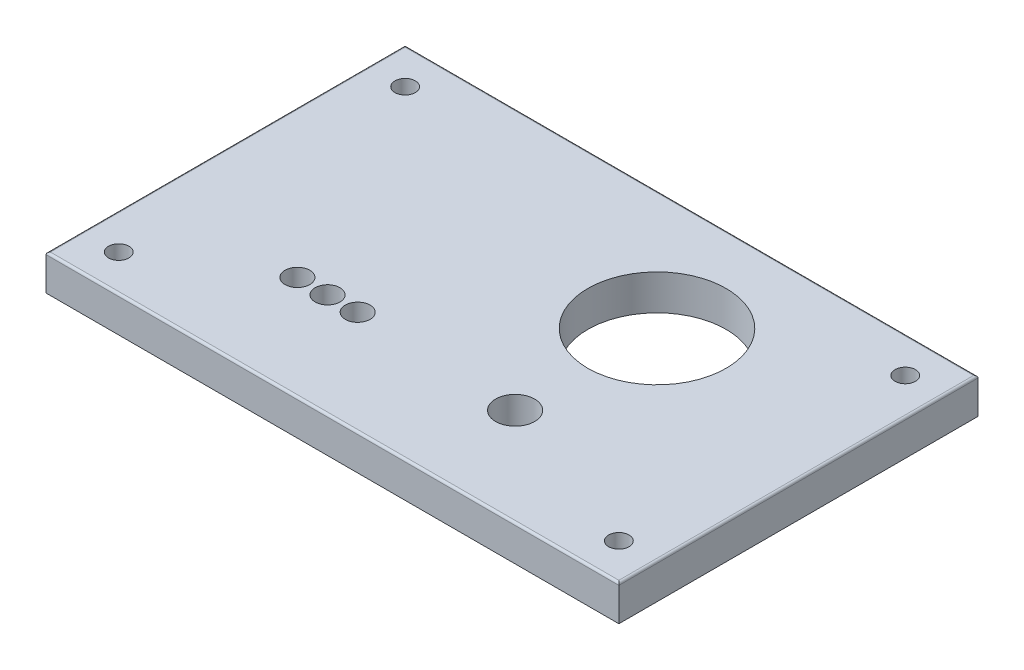
ISO-10303-21;
HEADER;
FILE_DESCRIPTION(('STEP AP214'),'2;1');
FILE_NAME('part.step','',(''),(''),'','','');
FILE_SCHEMA(('AUTOMOTIVE_DESIGN { 1 0 10303 214 1 1 1 1 }'));
ENDSEC;
DATA;
#1=APPLICATION_CONTEXT('core data for automotive mechanical design processes');
#2=APPLICATION_PROTOCOL_DEFINITION('international standard','automotive_design',2000,#1);
#3=PRODUCT_CONTEXT('',#1,'mechanical');
#4=PRODUCT('Part','Part','',(#3));
#5=PRODUCT_RELATED_PRODUCT_CATEGORY('part','',(#4));
#6=PRODUCT_DEFINITION_FORMATION('','',#4);
#7=PRODUCT_DEFINITION_CONTEXT('part definition',#1,'design');
#8=PRODUCT_DEFINITION('design','',#6,#7);
#9=PRODUCT_DEFINITION_SHAPE('','',#8);
#10=(LENGTH_UNIT() NAMED_UNIT(*) SI_UNIT(.MILLI.,.METRE.));
#11=(NAMED_UNIT(*) PLANE_ANGLE_UNIT() SI_UNIT($,.RADIAN.));
#12=(NAMED_UNIT(*) SI_UNIT($,.STERADIAN.) SOLID_ANGLE_UNIT());
#13=UNCERTAINTY_MEASURE_WITH_UNIT(LENGTH_MEASURE(1.E-05),#10,'distance_accuracy_value','');
#14=(GEOMETRIC_REPRESENTATION_CONTEXT(3) GLOBAL_UNCERTAINTY_ASSIGNED_CONTEXT((#13)) GLOBAL_UNIT_ASSIGNED_CONTEXT((#10,
#11,#12)) REPRESENTATION_CONTEXT('',''));
#15=CARTESIAN_POINT('',(0.,0.,0.));
#16=DIRECTION('',(0.,0.,1.));
#17=DIRECTION('',(1.,0.,0.));
#18=AXIS2_PLACEMENT_3D('',#15,#16,#17);
#19=CARTESIAN_POINT('',(0.,4.,20.25));
#20=DIRECTION('',(0.,0.,-1.));
#21=DIRECTION('',(-1.,0.,0.));
#22=AXIS2_PLACEMENT_3D('',#19,#20,#21);
#23=PLANE('',#22);
#24=DIRECTION('',(0.,-1.,0.));
#25=VECTOR('',#24,1.);
#26=CARTESIAN_POINT('',(32.3,4.,20.25));
#27=LINE('',#26,#25);
#28=CARTESIAN_POINT('',(32.3,3.75,20.25));
#29=VERTEX_POINT('',#28);
#30=CARTESIAN_POINT('',(32.3,0.,20.25));
#31=VERTEX_POINT('',#30);
#32=EDGE_CURVE('E93',#29,#31,#27,.T.);
#33=ORIENTED_EDGE('',*,*,#32,.F.);
#34=DIRECTION('',(1.,0.,0.));
#35=VECTOR('',#34,1.);
#36=CARTESIAN_POINT('',(-32.3,3.75,20.25));
#37=LINE('',#36,#35);
#38=CARTESIAN_POINT('',(-32.3,3.75,20.25));
#39=VERTEX_POINT('',#38);
#40=EDGE_CURVE('E48',#29,#39,#37,.F.);
#41=ORIENTED_EDGE('',*,*,#40,.T.);
#42=DIRECTION('',(0.,-1.,0.));
#43=VECTOR('',#42,1.);
#44=CARTESIAN_POINT('',(-32.3,4.,20.25));
#45=LINE('',#44,#43);
#46=CARTESIAN_POINT('',(-32.3,0.,20.25));
#47=VERTEX_POINT('',#46);
#48=EDGE_CURVE('E114',#39,#47,#45,.T.);
#49=ORIENTED_EDGE('',*,*,#48,.T.);
#50=DIRECTION('',(1.,0.,0.));
#51=VECTOR('',#50,1.);
#52=CARTESIAN_POINT('',(0.,0.,20.25));
#53=LINE('',#52,#51);
#54=EDGE_CURVE('E109',#47,#31,#53,.T.);
#55=ORIENTED_EDGE('',*,*,#54,.T.);
#56=EDGE_LOOP('',(#33,#41,#49,#55));
#57=FACE_BOUND('',#56,.T.);
#58=ADVANCED_FACE('F39',(#57),#23,.F.);
#59=CARTESIAN_POINT('',(32.3,4.,0.));
#60=DIRECTION('',(-1.,0.,0.));
#61=DIRECTION('',(0.,0.,1.));
#62=AXIS2_PLACEMENT_3D('',#59,#60,#61);
#63=PLANE('',#62);
#64=DIRECTION('',(0.,-1.,0.));
#65=VECTOR('',#64,1.);
#66=CARTESIAN_POINT('',(32.3,4.,-20.25));
#67=LINE('',#66,#65);
#68=CARTESIAN_POINT('',(32.3,3.75,-20.25));
#69=VERTEX_POINT('',#68);
#70=CARTESIAN_POINT('',(32.3,0.,-20.25));
#71=VERTEX_POINT('',#70);
#72=EDGE_CURVE('E103',#69,#71,#67,.T.);
#73=ORIENTED_EDGE('',*,*,#72,.F.);
#74=DIRECTION('',(0.,0.,-1.));
#75=VECTOR('',#74,1.);
#76=CARTESIAN_POINT('',(32.3,3.75,20.25));
#77=LINE('',#76,#75);
#78=EDGE_CURVE('E100',#69,#29,#77,.F.);
#79=ORIENTED_EDGE('',*,*,#78,.T.);
#80=ORIENTED_EDGE('',*,*,#32,.T.);
#81=DIRECTION('',(0.,0.,-1.));
#82=VECTOR('',#81,1.);
#83=CARTESIAN_POINT('',(32.3,0.,0.));
#84=LINE('',#83,#82);
#85=EDGE_CURVE('E97',#31,#71,#84,.T.);
#86=ORIENTED_EDGE('',*,*,#85,.T.);
#87=EDGE_LOOP('',(#73,#79,#80,#86));
#88=FACE_BOUND('',#87,.T.);
#89=ADVANCED_FACE('F96',(#88),#63,.F.);
#90=CARTESIAN_POINT('',(0.,4.,-20.25));
#91=DIRECTION('',(0.,0.,-1.));
#92=DIRECTION('',(-1.,0.,0.));
#93=AXIS2_PLACEMENT_3D('',#90,#91,#92);
#94=PLANE('',#93);
#95=DIRECTION('',(0.,-1.,0.));
#96=VECTOR('',#95,1.);
#97=CARTESIAN_POINT('',(-32.3,4.,-20.25));
#98=LINE('',#97,#96);
#99=CARTESIAN_POINT('',(-32.3,3.75,-20.25));
#100=VERTEX_POINT('',#99);
#101=CARTESIAN_POINT('',(-32.3,0.,-20.25));
#102=VERTEX_POINT('',#101);
#103=EDGE_CURVE('E127',#100,#102,#98,.T.);
#104=ORIENTED_EDGE('',*,*,#103,.F.);
#105=DIRECTION('',(1.,0.,0.));
#106=VECTOR('',#105,1.);
#107=CARTESIAN_POINT('',(0.,3.75,-20.25));
#108=LINE('',#107,#106);
#109=EDGE_CURVE('E11',#100,#69,#108,.T.);
#110=ORIENTED_EDGE('',*,*,#109,.T.);
#111=ORIENTED_EDGE('',*,*,#72,.T.);
#112=DIRECTION('',(1.,0.,0.));
#113=VECTOR('',#112,1.);
#114=CARTESIAN_POINT('',(0.,0.,-20.25));
#115=LINE('',#114,#113);
#116=EDGE_CURVE('E112',#102,#71,#115,.T.);
#117=ORIENTED_EDGE('',*,*,#116,.F.);
#118=EDGE_LOOP('',(#104,#110,#111,#117));
#119=FACE_BOUND('',#118,.T.);
#120=ADVANCED_FACE('F220',(#119),#94,.T.);
#121=CARTESIAN_POINT('',(9.59999999999998,4.,-6.75));
#122=DIRECTION('',(0.,-1.,0.));
#123=DIRECTION('',(0.,0.,-1.));
#124=AXIS2_PLACEMENT_3D('',#121,#122,#123);
#125=CYLINDRICAL_SURFACE('',#124,7.8);
#126=CARTESIAN_POINT('',(9.59999999999998,4.,-6.75));
#127=DIRECTION('',(0.,1.,0.));
#128=DIRECTION('',(0.,0.,1.));
#129=AXIS2_PLACEMENT_3D('',#126,#127,#128);
#130=CIRCLE('',#129,7.8);
#131=CARTESIAN_POINT('',(9.59999999999998,4.,1.05));
#132=VERTEX_POINT('',#131);
#133=EDGE_CURVE('E128',#132,#132,#130,.T.);
#134=ORIENTED_EDGE('',*,*,#133,.T.);
#135=EDGE_LOOP('',(#134));
#136=FACE_BOUND('',#135,.T.);
#137=CARTESIAN_POINT('',(9.59999999999998,0.,-6.75));
#138=DIRECTION('',(0.,1.,0.));
#139=DIRECTION('',(0.,0.,1.));
#140=AXIS2_PLACEMENT_3D('',#137,#138,#139);
#141=CIRCLE('',#140,7.8);
#142=CARTESIAN_POINT('',(9.59999999999998,0.,1.05));
#143=VERTEX_POINT('',#142);
#144=EDGE_CURVE('E115',#143,#143,#141,.T.);
#145=ORIENTED_EDGE('',*,*,#144,.F.);
#146=EDGE_LOOP('',(#145));
#147=FACE_BOUND('',#146,.T.);
#148=ADVANCED_FACE('F210',(#136,#147),#125,.F.);
#149=CARTESIAN_POINT('',(9.59999999999998,4.,9.25));
#150=DIRECTION('',(0.,-1.,0.));
#151=DIRECTION('',(0.,0.,-1.));
#152=AXIS2_PLACEMENT_3D('',#149,#150,#151);
#153=CYLINDRICAL_SURFACE('',#152,2.2);
#154=CARTESIAN_POINT('',(9.59999999999998,4.,9.25));
#155=DIRECTION('',(0.,1.,0.));
#156=DIRECTION('',(0.,0.,1.));
#157=AXIS2_PLACEMENT_3D('',#154,#155,#156);
#158=CIRCLE('',#157,2.2);
#159=CARTESIAN_POINT('',(9.59999999999998,4.,11.45));
#160=VERTEX_POINT('',#159);
#161=EDGE_CURVE('E190',#160,#160,#158,.T.);
#162=ORIENTED_EDGE('',*,*,#161,.T.);
#163=EDGE_LOOP('',(#162));
#164=FACE_BOUND('',#163,.T.);
#165=CARTESIAN_POINT('',(9.59999999999998,0.,9.25));
#166=DIRECTION('',(0.,1.,0.));
#167=DIRECTION('',(0.,0.,1.));
#168=AXIS2_PLACEMENT_3D('',#165,#166,#167);
#169=CIRCLE('',#168,2.2);
#170=CARTESIAN_POINT('',(9.59999999999998,0.,11.45));
#171=VERTEX_POINT('',#170);
#172=EDGE_CURVE('E118',#171,#171,#169,.T.);
#173=ORIENTED_EDGE('',*,*,#172,.F.);
#174=EDGE_LOOP('',(#173));
#175=FACE_BOUND('',#174,.T.);
#176=ADVANCED_FACE('F207',(#164,#175),#153,.F.);
#177=CARTESIAN_POINT('',(-12.25,4.,8.55));
#178=DIRECTION('',(0.,-1.,0.));
#179=DIRECTION('',(0.,0.,-1.));
#180=AXIS2_PLACEMENT_3D('',#177,#178,#179);
#181=CYLINDRICAL_SURFACE('',#180,1.4);
#182=CARTESIAN_POINT('',(-12.25,4.,8.55));
#183=DIRECTION('',(0.,1.,0.));
#184=DIRECTION('',(0.,0.,1.));
#185=AXIS2_PLACEMENT_3D('',#182,#183,#184);
#186=CIRCLE('',#185,1.4);
#187=CARTESIAN_POINT('',(-12.25,4.,9.95));
#188=VERTEX_POINT('',#187);
#189=EDGE_CURVE('E187',#188,#188,#186,.T.);
#190=ORIENTED_EDGE('',*,*,#189,.T.);
#191=EDGE_LOOP('',(#190));
#192=FACE_BOUND('',#191,.T.);
#193=CARTESIAN_POINT('',(-12.25,0.,8.55));
#194=DIRECTION('',(0.,1.,0.));
#195=DIRECTION('',(0.,0.,1.));
#196=AXIS2_PLACEMENT_3D('',#193,#194,#195);
#197=CIRCLE('',#196,1.4);
#198=CARTESIAN_POINT('',(-12.25,0.,9.95));
#199=VERTEX_POINT('',#198);
#200=EDGE_CURVE('E200',#199,#199,#197,.T.);
#201=ORIENTED_EDGE('',*,*,#200,.F.);
#202=EDGE_LOOP('',(#201));
#203=FACE_BOUND('',#202,.T.);
#204=ADVANCED_FACE('F209',(#192,#203),#181,.F.);
#205=CARTESIAN_POINT('',(-8.84999999999998,4.,8.55));
#206=DIRECTION('',(0.,-1.,0.));
#207=DIRECTION('',(0.,0.,-1.));
#208=AXIS2_PLACEMENT_3D('',#205,#206,#207);
#209=CYLINDRICAL_SURFACE('',#208,1.4);
#210=CARTESIAN_POINT('',(-8.84999999999998,4.,8.55));
#211=DIRECTION('',(0.,1.,0.));
#212=DIRECTION('',(0.,0.,1.));
#213=AXIS2_PLACEMENT_3D('',#210,#211,#212);
#214=CIRCLE('',#213,1.4);
#215=CARTESIAN_POINT('',(-8.84999999999998,4.,9.95));
#216=VERTEX_POINT('',#215);
#217=EDGE_CURVE('E184',#216,#216,#214,.T.);
#218=ORIENTED_EDGE('',*,*,#217,.T.);
#219=EDGE_LOOP('',(#218));
#220=FACE_BOUND('',#219,.T.);
#221=CARTESIAN_POINT('',(-8.84999999999998,0.,8.55));
#222=DIRECTION('',(0.,1.,0.));
#223=DIRECTION('',(0.,0.,1.));
#224=AXIS2_PLACEMENT_3D('',#221,#222,#223);
#225=CIRCLE('',#224,1.4);
#226=CARTESIAN_POINT('',(-8.84999999999998,0.,9.95));
#227=VERTEX_POINT('',#226);
#228=EDGE_CURVE('E197',#227,#227,#225,.T.);
#229=ORIENTED_EDGE('',*,*,#228,.F.);
#230=EDGE_LOOP('',(#229));
#231=FACE_BOUND('',#230,.T.);
#232=ADVANCED_FACE('F217',(#220,#231),#209,.F.);
#233=CARTESIAN_POINT('',(-15.65,4.,8.55));
#234=DIRECTION('',(0.,-1.,0.));
#235=DIRECTION('',(0.,0.,-1.));
#236=AXIS2_PLACEMENT_3D('',#233,#234,#235);
#237=CYLINDRICAL_SURFACE('',#236,1.4);
#238=CARTESIAN_POINT('',(-15.65,4.,8.55));
#239=DIRECTION('',(0.,1.,0.));
#240=DIRECTION('',(0.,0.,1.));
#241=AXIS2_PLACEMENT_3D('',#238,#239,#240);
#242=CIRCLE('',#241,1.4);
#243=CARTESIAN_POINT('',(-15.65,4.,9.95));
#244=VERTEX_POINT('',#243);
#245=EDGE_CURVE('E125',#244,#244,#242,.T.);
#246=ORIENTED_EDGE('',*,*,#245,.T.);
#247=EDGE_LOOP('',(#246));
#248=FACE_BOUND('',#247,.T.);
#249=CARTESIAN_POINT('',(-15.65,0.,8.55));
#250=DIRECTION('',(0.,1.,0.));
#251=DIRECTION('',(0.,0.,1.));
#252=AXIS2_PLACEMENT_3D('',#249,#250,#251);
#253=CIRCLE('',#252,1.4);
#254=CARTESIAN_POINT('',(-15.65,0.,9.95));
#255=VERTEX_POINT('',#254);
#256=EDGE_CURVE('E144',#255,#255,#253,.T.);
#257=ORIENTED_EDGE('',*,*,#256,.F.);
#258=EDGE_LOOP('',(#257));
#259=FACE_BOUND('',#258,.T.);
#260=ADVANCED_FACE('F237',(#248,#259),#237,.F.);
#261=CARTESIAN_POINT('',(-32.3,4.,0.));
#262=DIRECTION('',(-1.,0.,0.));
#263=DIRECTION('',(0.,0.,1.));
#264=AXIS2_PLACEMENT_3D('',#261,#262,#263);
#265=PLANE('',#264);
#266=ORIENTED_EDGE('',*,*,#48,.F.);
#267=DIRECTION('',(0.,0.,-1.));
#268=VECTOR('',#267,1.);
#269=CARTESIAN_POINT('',(-32.3,3.75,0.));
#270=LINE('',#269,#268);
#271=EDGE_CURVE('E56',#39,#100,#270,.T.);
#272=ORIENTED_EDGE('',*,*,#271,.T.);
#273=ORIENTED_EDGE('',*,*,#103,.T.);
#274=DIRECTION('',(0.,0.,-1.));
#275=VECTOR('',#274,1.);
#276=CARTESIAN_POINT('',(-32.3,0.,0.));
#277=LINE('',#276,#275);
#278=EDGE_CURVE('E123',#47,#102,#277,.T.);
#279=ORIENTED_EDGE('',*,*,#278,.F.);
#280=EDGE_LOOP('',(#266,#272,#273,#279));
#281=FACE_BOUND('',#280,.T.);
#282=ADVANCED_FACE('F233',(#281),#265,.T.);
#283=CARTESIAN_POINT('',(0.,4.,0.));
#284=DIRECTION('',(0.,1.,0.));
#285=DIRECTION('',(0.,0.,1.));
#286=AXIS2_PLACEMENT_3D('',#283,#284,#285);
#287=PLANE('',#286);
#288=DIRECTION('',(0.,0.,-1.));
#289=VECTOR('',#288,1.);
#290=CARTESIAN_POINT('',(-32.05,4.,0.));
#291=LINE('',#290,#289);
#292=CARTESIAN_POINT('',(-32.05,4.,-20.));
#293=VERTEX_POINT('',#292);
#294=CARTESIAN_POINT('',(-32.05,4.,20.));
#295=VERTEX_POINT('',#294);
#296=EDGE_CURVE('E146',#293,#295,#291,.F.);
#297=ORIENTED_EDGE('',*,*,#296,.T.);
#298=DIRECTION('',(1.,0.,0.));
#299=VECTOR('',#298,1.);
#300=CARTESIAN_POINT('',(32.3,4.,20.));
#301=LINE('',#300,#299);
#302=CARTESIAN_POINT('',(32.05,4.,20.));
#303=VERTEX_POINT('',#302);
#304=EDGE_CURVE('E151',#295,#303,#301,.T.);
#305=ORIENTED_EDGE('',*,*,#304,.T.);
#306=DIRECTION('',(0.,0.,-1.));
#307=VECTOR('',#306,1.);
#308=CARTESIAN_POINT('',(32.05,4.,-20.25));
#309=LINE('',#308,#307);
#310=CARTESIAN_POINT('',(32.05,4.,-20.));
#311=VERTEX_POINT('',#310);
#312=EDGE_CURVE('E148',#303,#311,#309,.T.);
#313=ORIENTED_EDGE('',*,*,#312,.T.);
#314=DIRECTION('',(1.,0.,0.));
#315=VECTOR('',#314,1.);
#316=CARTESIAN_POINT('',(0.,4.,-20.));
#317=LINE('',#316,#315);
#318=EDGE_CURVE('E102',#311,#293,#317,.F.);
#319=ORIENTED_EDGE('',*,*,#318,.T.);
#320=EDGE_LOOP('',(#297,#305,#313,#319));
#321=FACE_BOUND('',#320,.T.);
#322=CARTESIAN_POINT('',(-28.2,4.,16.15));
#323=DIRECTION('',(0.,1.,0.));
#324=DIRECTION('',(0.,0.,-1.));
#325=AXIS2_PLACEMENT_3D('',#322,#323,#324);
#326=CIRCLE('',#325,1.15);
#327=CARTESIAN_POINT('',(-28.2,4.,15.));
#328=VERTEX_POINT('',#327);
#329=EDGE_CURVE('E166',#328,#328,#326,.T.);
#330=ORIENTED_EDGE('',*,*,#329,.F.);
#331=EDGE_LOOP('',(#330));
#332=FACE_BOUND('',#331,.T.);
#333=CARTESIAN_POINT('',(28.2,4.,16.15));
#334=DIRECTION('',(0.,1.,0.));
#335=DIRECTION('',(0.,0.,1.));
#336=AXIS2_PLACEMENT_3D('',#333,#334,#335);
#337=CIRCLE('',#336,1.15);
#338=CARTESIAN_POINT('',(28.2,4.,17.3));
#339=VERTEX_POINT('',#338);
#340=EDGE_CURVE('E171',#339,#339,#337,.T.);
#341=ORIENTED_EDGE('',*,*,#340,.F.);
#342=EDGE_LOOP('',(#341));
#343=FACE_BOUND('',#342,.T.);
#344=CARTESIAN_POINT('',(28.2,4.,-16.15));
#345=DIRECTION('',(0.,1.,0.));
#346=DIRECTION('',(0.,0.,-1.));
#347=AXIS2_PLACEMENT_3D('',#344,#345,#346);
#348=CIRCLE('',#347,1.15);
#349=CARTESIAN_POINT('',(28.2,4.,-17.3));
#350=VERTEX_POINT('',#349);
#351=EDGE_CURVE('E176',#350,#350,#348,.T.);
#352=ORIENTED_EDGE('',*,*,#351,.F.);
#353=EDGE_LOOP('',(#352));
#354=FACE_BOUND('',#353,.T.);
#355=CARTESIAN_POINT('',(-28.2,4.,-16.15));
#356=DIRECTION('',(0.,1.,0.));
#357=DIRECTION('',(0.,0.,1.));
#358=AXIS2_PLACEMENT_3D('',#355,#356,#357);
#359=CIRCLE('',#358,1.15);
#360=CARTESIAN_POINT('',(-28.2,4.,-15.));
#361=VERTEX_POINT('',#360);
#362=EDGE_CURVE('E135',#361,#361,#359,.T.);
#363=ORIENTED_EDGE('',*,*,#362,.F.);
#364=EDGE_LOOP('',(#363));
#365=FACE_BOUND('',#364,.T.);
#366=ORIENTED_EDGE('',*,*,#245,.F.);
#367=EDGE_LOOP('',(#366));
#368=FACE_BOUND('',#367,.T.);
#369=ORIENTED_EDGE('',*,*,#217,.F.);
#370=EDGE_LOOP('',(#369));
#371=FACE_BOUND('',#370,.T.);
#372=ORIENTED_EDGE('',*,*,#189,.F.);
#373=EDGE_LOOP('',(#372));
#374=FACE_BOUND('',#373,.T.);
#375=ORIENTED_EDGE('',*,*,#161,.F.);
#376=EDGE_LOOP('',(#375));
#377=FACE_BOUND('',#376,.T.);
#378=ORIENTED_EDGE('',*,*,#133,.F.);
#379=EDGE_LOOP('',(#378));
#380=FACE_BOUND('',#379,.T.);
#381=ADVANCED_FACE('F236',(#321,#332,#343,#354,#365,#368,#371,#374,#377,#380),#287,.T.);
#382=CARTESIAN_POINT('',(0.,0.,0.));
#383=DIRECTION('',(0.,1.,0.));
#384=DIRECTION('',(0.,0.,1.));
#385=AXIS2_PLACEMENT_3D('',#382,#383,#384);
#386=PLANE('',#385);
#387=CARTESIAN_POINT('',(-28.2,0.,16.15));
#388=DIRECTION('',(0.,1.,0.));
#389=DIRECTION('',(0.,0.,1.));
#390=AXIS2_PLACEMENT_3D('',#387,#388,#389);
#391=CIRCLE('',#390,1.15);
#392=CARTESIAN_POINT('',(-28.2,0.,17.3));
#393=VERTEX_POINT('',#392);
#394=EDGE_CURVE('E141',#393,#393,#391,.T.);
#395=ORIENTED_EDGE('',*,*,#394,.T.);
#396=EDGE_LOOP('',(#395));
#397=FACE_BOUND('',#396,.T.);
#398=CARTESIAN_POINT('',(28.2,0.,16.15));
#399=DIRECTION('',(0.,1.,0.));
#400=DIRECTION('',(0.,0.,1.));
#401=AXIS2_PLACEMENT_3D('',#398,#399,#400);
#402=CIRCLE('',#401,1.15);
#403=CARTESIAN_POINT('',(28.2,0.,17.3));
#404=VERTEX_POINT('',#403);
#405=EDGE_CURVE('E138',#404,#404,#402,.T.);
#406=ORIENTED_EDGE('',*,*,#405,.T.);
#407=EDGE_LOOP('',(#406));
#408=FACE_BOUND('',#407,.T.);
#409=CARTESIAN_POINT('',(28.2,0.,-16.15));
#410=DIRECTION('',(0.,1.,0.));
#411=DIRECTION('',(0.,0.,1.));
#412=AXIS2_PLACEMENT_3D('',#409,#410,#411);
#413=CIRCLE('',#412,1.15);
#414=CARTESIAN_POINT('',(28.2,0.,-15.));
#415=VERTEX_POINT('',#414);
#416=EDGE_CURVE('E134',#415,#415,#413,.T.);
#417=ORIENTED_EDGE('',*,*,#416,.T.);
#418=EDGE_LOOP('',(#417));
#419=FACE_BOUND('',#418,.T.);
#420=CARTESIAN_POINT('',(-28.2,0.,-16.15));
#421=DIRECTION('',(0.,1.,0.));
#422=DIRECTION('',(0.,0.,1.));
#423=AXIS2_PLACEMENT_3D('',#420,#421,#422);
#424=CIRCLE('',#423,1.15);
#425=CARTESIAN_POINT('',(-28.2,0.,-15.));
#426=VERTEX_POINT('',#425);
#427=EDGE_CURVE('E131',#426,#426,#424,.T.);
#428=ORIENTED_EDGE('',*,*,#427,.T.);
#429=EDGE_LOOP('',(#428));
#430=FACE_BOUND('',#429,.T.);
#431=ORIENTED_EDGE('',*,*,#256,.T.);
#432=EDGE_LOOP('',(#431));
#433=FACE_BOUND('',#432,.T.);
#434=ORIENTED_EDGE('',*,*,#228,.T.);
#435=EDGE_LOOP('',(#434));
#436=FACE_BOUND('',#435,.T.);
#437=ORIENTED_EDGE('',*,*,#200,.T.);
#438=EDGE_LOOP('',(#437));
#439=FACE_BOUND('',#438,.T.);
#440=ORIENTED_EDGE('',*,*,#172,.T.);
#441=EDGE_LOOP('',(#440));
#442=FACE_BOUND('',#441,.T.);
#443=ORIENTED_EDGE('',*,*,#144,.T.);
#444=EDGE_LOOP('',(#443));
#445=FACE_BOUND('',#444,.T.);
#446=ORIENTED_EDGE('',*,*,#54,.F.);
#447=ORIENTED_EDGE('',*,*,#278,.T.);
#448=ORIENTED_EDGE('',*,*,#116,.T.);
#449=ORIENTED_EDGE('',*,*,#85,.F.);
#450=EDGE_LOOP('',(#446,#447,#448,#449));
#451=FACE_BOUND('',#450,.T.);
#452=ADVANCED_FACE('F107',(#397,#408,#419,#430,#433,#436,#439,#442,#445,#451),#386,.F.);
#453=CARTESIAN_POINT('',(-28.2,-1.,-16.15));
#454=DIRECTION('',(0.,1.,0.));
#455=DIRECTION('',(0.,0.,1.));
#456=AXIS2_PLACEMENT_3D('',#453,#454,#455);
#457=CYLINDRICAL_SURFACE('',#456,1.15);
#458=ORIENTED_EDGE('',*,*,#362,.T.);
#459=EDGE_LOOP('',(#458));
#460=FACE_BOUND('',#459,.T.);
#461=ORIENTED_EDGE('',*,*,#427,.F.);
#462=EDGE_LOOP('',(#461));
#463=FACE_BOUND('',#462,.T.);
#464=ADVANCED_FACE('F240',(#460,#463),#457,.F.);
#465=CARTESIAN_POINT('',(28.2,-1.,-16.15));
#466=DIRECTION('',(0.,1.,0.));
#467=DIRECTION('',(0.,0.,1.));
#468=AXIS2_PLACEMENT_3D('',#465,#466,#467);
#469=CYLINDRICAL_SURFACE('',#468,1.15);
#470=ORIENTED_EDGE('',*,*,#351,.T.);
#471=EDGE_LOOP('',(#470));
#472=FACE_BOUND('',#471,.T.);
#473=ORIENTED_EDGE('',*,*,#416,.F.);
#474=EDGE_LOOP('',(#473));
#475=FACE_BOUND('',#474,.T.);
#476=ADVANCED_FACE('F247',(#472,#475),#469,.F.);
#477=CARTESIAN_POINT('',(28.2,-1.,16.15));
#478=DIRECTION('',(0.,1.,0.));
#479=DIRECTION('',(0.,0.,1.));
#480=AXIS2_PLACEMENT_3D('',#477,#478,#479);
#481=CYLINDRICAL_SURFACE('',#480,1.15);
#482=ORIENTED_EDGE('',*,*,#340,.T.);
#483=EDGE_LOOP('',(#482));
#484=FACE_BOUND('',#483,.T.);
#485=ORIENTED_EDGE('',*,*,#405,.F.);
#486=EDGE_LOOP('',(#485));
#487=FACE_BOUND('',#486,.T.);
#488=ADVANCED_FACE('F252',(#484,#487),#481,.F.);
#489=CARTESIAN_POINT('',(-28.2,-1.,16.15));
#490=DIRECTION('',(0.,1.,0.));
#491=DIRECTION('',(0.,0.,1.));
#492=AXIS2_PLACEMENT_3D('',#489,#490,#491);
#493=CYLINDRICAL_SURFACE('',#492,1.15);
#494=ORIENTED_EDGE('',*,*,#329,.T.);
#495=EDGE_LOOP('',(#494));
#496=FACE_BOUND('',#495,.T.);
#497=ORIENTED_EDGE('',*,*,#394,.F.);
#498=EDGE_LOOP('',(#497));
#499=FACE_BOUND('',#498,.T.);
#500=ADVANCED_FACE('F249',(#496,#499),#493,.F.);
#501=CARTESIAN_POINT('',(-32.05,3.75,0.));
#502=DIRECTION('',(0.,0.,-1.));
#503=DIRECTION('',(-1.,0.,0.));
#504=AXIS2_PLACEMENT_3D('',#501,#502,#503);
#505=CYLINDRICAL_SURFACE('',#504,0.25);
#506=CARTESIAN_POINT('',(-32.05,3.75,-20.));
#507=DIRECTION('',(0.707106781186547,0.,-0.707106781186547));
#508=DIRECTION('',(0.707106781186547,0.,0.707106781186547));
#509=AXIS2_PLACEMENT_3D('',#506,#507,#508);
#510=ELLIPSE('',#509,0.353553390593274,0.25);
#511=EDGE_CURVE('E159',#100,#293,#510,.T.);
#512=ORIENTED_EDGE('',*,*,#511,.F.);
#513=ORIENTED_EDGE('',*,*,#271,.F.);
#514=CARTESIAN_POINT('',(-32.05,3.75,20.));
#515=DIRECTION('',(-0.707106781186547,0.,-0.707106781186547));
#516=DIRECTION('',(-0.707106781186547,0.,0.707106781186547));
#517=AXIS2_PLACEMENT_3D('',#514,#515,#516);
#518=ELLIPSE('',#517,0.353553390593274,0.25);
#519=EDGE_CURVE('E43',#295,#39,#518,.F.);
#520=ORIENTED_EDGE('',*,*,#519,.F.);
#521=ORIENTED_EDGE('',*,*,#296,.F.);
#522=EDGE_LOOP('',(#512,#513,#520,#521));
#523=FACE_BOUND('',#522,.T.);
#524=ADVANCED_FACE('F41',(#523),#505,.T.);
#525=CARTESIAN_POINT('',(0.,3.75,20.));
#526=DIRECTION('',(-1.,0.,0.));
#527=DIRECTION('',(0.,0.,1.));
#528=AXIS2_PLACEMENT_3D('',#525,#526,#527);
#529=CYLINDRICAL_SURFACE('',#528,0.25);
#530=ORIENTED_EDGE('',*,*,#519,.T.);
#531=ORIENTED_EDGE('',*,*,#40,.F.);
#532=CARTESIAN_POINT('',(32.05,3.75,20.));
#533=DIRECTION('',(-0.707106781186547,0.,0.707106781186547));
#534=DIRECTION('',(-0.707106781186547,0.,-0.707106781186547));
#535=AXIS2_PLACEMENT_3D('',#532,#533,#534);
#536=ELLIPSE('',#535,0.353553390593274,0.25);
#537=EDGE_CURVE('E158',#303,#29,#536,.F.);
#538=ORIENTED_EDGE('',*,*,#537,.F.);
#539=ORIENTED_EDGE('',*,*,#304,.F.);
#540=EDGE_LOOP('',(#530,#531,#538,#539));
#541=FACE_BOUND('',#540,.T.);
#542=ADVANCED_FACE('F290',(#541),#529,.T.);
#543=CARTESIAN_POINT('',(0.,3.75,-20.));
#544=DIRECTION('',(1.,0.,0.));
#545=DIRECTION('',(0.,0.,-1.));
#546=AXIS2_PLACEMENT_3D('',#543,#544,#545);
#547=CYLINDRICAL_SURFACE('',#546,0.25);
#548=ORIENTED_EDGE('',*,*,#511,.T.);
#549=ORIENTED_EDGE('',*,*,#318,.F.);
#550=CARTESIAN_POINT('',(32.05,3.75,-20.));
#551=DIRECTION('',(0.707106781186547,0.,0.707106781186547));
#552=DIRECTION('',(0.707106781186547,0.,-0.707106781186547));
#553=AXIS2_PLACEMENT_3D('',#550,#551,#552);
#554=ELLIPSE('',#553,0.353553390593274,0.25);
#555=EDGE_CURVE('E156',#69,#311,#554,.T.);
#556=ORIENTED_EDGE('',*,*,#555,.F.);
#557=ORIENTED_EDGE('',*,*,#109,.F.);
#558=EDGE_LOOP('',(#548,#549,#556,#557));
#559=FACE_BOUND('',#558,.T.);
#560=ADVANCED_FACE('F287',(#559),#547,.T.);
#561=CARTESIAN_POINT('',(32.05,3.75,0.));
#562=DIRECTION('',(0.,0.,1.));
#563=DIRECTION('',(1.,0.,0.));
#564=AXIS2_PLACEMENT_3D('',#561,#562,#563);
#565=CYLINDRICAL_SURFACE('',#564,0.25);
#566=ORIENTED_EDGE('',*,*,#537,.T.);
#567=ORIENTED_EDGE('',*,*,#78,.F.);
#568=ORIENTED_EDGE('',*,*,#555,.T.);
#569=ORIENTED_EDGE('',*,*,#312,.F.);
#570=EDGE_LOOP('',(#566,#567,#568,#569));
#571=FACE_BOUND('',#570,.T.);
#572=ADVANCED_FACE('F284',(#571),#565,.T.);
#573=CLOSED_SHELL('',(#58,#89,#120,#148,#176,#204,#232,#260,#282,#381,#452,#464,#476,#488,#500,
#524,#542,#560,#572));
#574=MANIFOLD_SOLID_BREP('B2',#573);
#575=ADVANCED_BREP_SHAPE_REPRESENTATION('',(#18,#574),#14);
#576=SHAPE_DEFINITION_REPRESENTATION(#9,#575);
ENDSEC;
END-ISO-10303-21;
